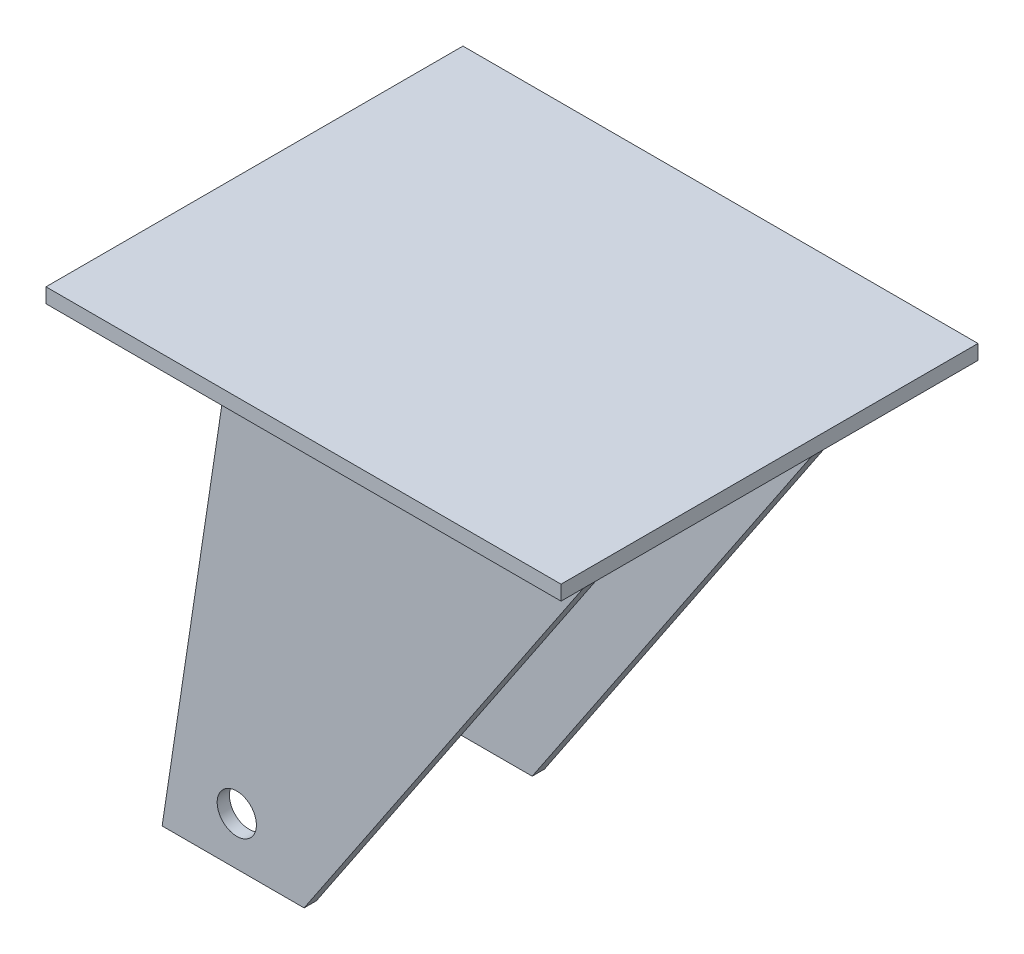
ISO-10303-21;
HEADER;
FILE_DESCRIPTION(('STEP AP214'),'2;1');
FILE_NAME('part.step','',(''),(''),'','','');
FILE_SCHEMA(('AUTOMOTIVE_DESIGN { 1 0 10303 214 1 1 1 1 }'));
ENDSEC;
DATA;
#1=APPLICATION_CONTEXT('core data for automotive mechanical design processes');
#2=APPLICATION_PROTOCOL_DEFINITION('international standard','automotive_design',2000,#1);
#3=PRODUCT_CONTEXT('',#1,'mechanical');
#4=PRODUCT('Part','Part','',(#3));
#5=PRODUCT_RELATED_PRODUCT_CATEGORY('part','',(#4));
#6=PRODUCT_DEFINITION_FORMATION('','',#4);
#7=PRODUCT_DEFINITION_CONTEXT('part definition',#1,'design');
#8=PRODUCT_DEFINITION('design','',#6,#7);
#9=PRODUCT_DEFINITION_SHAPE('','',#8);
#10=(LENGTH_UNIT() NAMED_UNIT(*) SI_UNIT(.MILLI.,.METRE.));
#11=(NAMED_UNIT(*) PLANE_ANGLE_UNIT() SI_UNIT($,.RADIAN.));
#12=(NAMED_UNIT(*) SI_UNIT($,.STERADIAN.) SOLID_ANGLE_UNIT());
#13=UNCERTAINTY_MEASURE_WITH_UNIT(LENGTH_MEASURE(1.E-05),#10,'distance_accuracy_value','');
#14=(GEOMETRIC_REPRESENTATION_CONTEXT(3) GLOBAL_UNCERTAINTY_ASSIGNED_CONTEXT((#13)) GLOBAL_UNIT_ASSIGNED_CONTEXT((#10,
#11,#12)) REPRESENTATION_CONTEXT('',''));
#15=CARTESIAN_POINT('',(0.,0.,0.));
#16=DIRECTION('',(0.,0.,1.));
#17=DIRECTION('',(1.,0.,0.));
#18=AXIS2_PLACEMENT_3D('',#15,#16,#17);
#19=CARTESIAN_POINT('',(-58.5630235636927,3.,-67.981367852476));
#20=DIRECTION('',(1.,0.,0.));
#21=DIRECTION('',(0.,0.,-1.));
#22=AXIS2_PLACEMENT_3D('',#19,#20,#21);
#23=PLANE('',#22);
#24=DIRECTION('',(0.,0.,1.));
#25=VECTOR('',#24,1.);
#26=CARTESIAN_POINT('',(-58.5630235636927,0.,-67.981367852476));
#27=LINE('',#26,#25);
#28=CARTESIAN_POINT('',(-58.5630235636927,0.,-152.981367852476));
#29=VERTEX_POINT('',#28);
#30=CARTESIAN_POINT('',(-58.5630235636927,0.,-67.981367852476));
#31=VERTEX_POINT('',#30);
#32=EDGE_CURVE('E185',#29,#31,#27,.T.);
#33=ORIENTED_EDGE('',*,*,#32,.T.);
#34=DIRECTION('',(0.,-1.,0.));
#35=VECTOR('',#34,1.);
#36=CARTESIAN_POINT('',(-58.5630235636927,3.,-67.981367852476));
#37=LINE('',#36,#35);
#38=CARTESIAN_POINT('',(-58.5630235636927,3.,-67.981367852476));
#39=VERTEX_POINT('',#38);
#40=EDGE_CURVE('E11',#39,#31,#37,.T.);
#41=ORIENTED_EDGE('',*,*,#40,.F.);
#42=DIRECTION('',(0.,0.,1.));
#43=VECTOR('',#42,1.);
#44=CARTESIAN_POINT('',(-58.5630235636927,3.,-67.981367852476));
#45=LINE('',#44,#43);
#46=CARTESIAN_POINT('',(-58.5630235636927,3.,-152.981367852476));
#47=VERTEX_POINT('',#46);
#48=EDGE_CURVE('E192',#47,#39,#45,.T.);
#49=ORIENTED_EDGE('',*,*,#48,.F.);
#50=DIRECTION('',(0.,-1.,0.));
#51=VECTOR('',#50,1.);
#52=CARTESIAN_POINT('',(-58.5630235636927,3.,-152.981367852476));
#53=LINE('',#52,#51);
#54=EDGE_CURVE('E202',#47,#29,#53,.T.);
#55=ORIENTED_EDGE('',*,*,#54,.T.);
#56=EDGE_LOOP('',(#33,#41,#49,#55));
#57=FACE_BOUND('',#56,.T.);
#58=ADVANCED_FACE('F33',(#57),#23,.F.);
#59=CARTESIAN_POINT('',(46.4369764363073,3.,-67.9813678524761));
#60=DIRECTION('',(0.,0.,-1.));
#61=DIRECTION('',(-1.,0.,0.));
#62=AXIS2_PLACEMENT_3D('',#59,#60,#61);
#63=PLANE('',#62);
#64=DIRECTION('',(1.,0.,0.));
#65=VECTOR('',#64,1.);
#66=CARTESIAN_POINT('',(46.4369764363073,0.,-67.9813678524761));
#67=LINE('',#66,#65);
#68=CARTESIAN_POINT('',(46.4369764363073,0.,-67.9813678524761));
#69=VERTEX_POINT('',#68);
#70=EDGE_CURVE('E205',#31,#69,#67,.T.);
#71=ORIENTED_EDGE('',*,*,#70,.T.);
#72=DIRECTION('',(0.,-1.,0.));
#73=VECTOR('',#72,1.);
#74=CARTESIAN_POINT('',(46.4369764363073,3.,-67.9813678524761));
#75=LINE('',#74,#73);
#76=CARTESIAN_POINT('',(46.4369764363073,3.,-67.9813678524761));
#77=VERTEX_POINT('',#76);
#78=EDGE_CURVE('E40',#77,#69,#75,.T.);
#79=ORIENTED_EDGE('',*,*,#78,.F.);
#80=DIRECTION('',(1.,0.,0.));
#81=VECTOR('',#80,1.);
#82=CARTESIAN_POINT('',(46.4369764363073,3.,-67.9813678524761));
#83=LINE('',#82,#81);
#84=EDGE_CURVE('E195',#39,#77,#83,.T.);
#85=ORIENTED_EDGE('',*,*,#84,.F.);
#86=ORIENTED_EDGE('',*,*,#40,.T.);
#87=EDGE_LOOP('',(#71,#79,#85,#86));
#88=FACE_BOUND('',#87,.T.);
#89=ADVANCED_FACE('F235',(#88),#63,.F.);
#90=CARTESIAN_POINT('',(46.4369764363073,3.,-67.9813678524761));
#91=DIRECTION('',(-1.,0.,0.));
#92=DIRECTION('',(0.,0.,1.));
#93=AXIS2_PLACEMENT_3D('',#90,#91,#92);
#94=PLANE('',#93);
#95=DIRECTION('',(0.,0.,-1.));
#96=VECTOR('',#95,1.);
#97=CARTESIAN_POINT('',(46.4369764363073,0.,-67.9813678524761));
#98=LINE('',#97,#96);
#99=CARTESIAN_POINT('',(46.4369764363073,0.,-152.981367852476));
#100=VERTEX_POINT('',#99);
#101=EDGE_CURVE('E207',#69,#100,#98,.T.);
#102=ORIENTED_EDGE('',*,*,#101,.T.);
#103=DIRECTION('',(0.,-1.,0.));
#104=VECTOR('',#103,1.);
#105=CARTESIAN_POINT('',(46.4369764363073,3.,-152.981367852476));
#106=LINE('',#105,#104);
#107=CARTESIAN_POINT('',(46.4369764363073,3.,-152.981367852476));
#108=VERTEX_POINT('',#107);
#109=EDGE_CURVE('E212',#108,#100,#106,.T.);
#110=ORIENTED_EDGE('',*,*,#109,.F.);
#111=DIRECTION('',(0.,0.,-1.));
#112=VECTOR('',#111,1.);
#113=CARTESIAN_POINT('',(46.4369764363073,3.,-67.9813678524761));
#114=LINE('',#113,#112);
#115=EDGE_CURVE('E198',#77,#108,#114,.T.);
#116=ORIENTED_EDGE('',*,*,#115,.F.);
#117=ORIENTED_EDGE('',*,*,#78,.T.);
#118=EDGE_LOOP('',(#102,#110,#116,#117));
#119=FACE_BOUND('',#118,.T.);
#120=ADVANCED_FACE('F219',(#119),#94,.F.);
#121=CARTESIAN_POINT('',(46.4369764363073,3.,-152.981367852476));
#122=DIRECTION('',(0.,0.,1.));
#123=DIRECTION('',(1.,0.,0.));
#124=AXIS2_PLACEMENT_3D('',#121,#122,#123);
#125=PLANE('',#124);
#126=DIRECTION('',(-1.,0.,0.));
#127=VECTOR('',#126,1.);
#128=CARTESIAN_POINT('',(46.4369764363073,0.,-152.981367852476));
#129=LINE('',#128,#127);
#130=EDGE_CURVE('E196',#100,#29,#129,.T.);
#131=ORIENTED_EDGE('',*,*,#130,.T.);
#132=ORIENTED_EDGE('',*,*,#54,.F.);
#133=DIRECTION('',(-1.,0.,0.));
#134=VECTOR('',#133,1.);
#135=CARTESIAN_POINT('',(46.4369764363073,3.,-152.981367852476));
#136=LINE('',#135,#134);
#137=EDGE_CURVE('E200',#108,#47,#136,.T.);
#138=ORIENTED_EDGE('',*,*,#137,.F.);
#139=ORIENTED_EDGE('',*,*,#109,.T.);
#140=EDGE_LOOP('',(#131,#132,#138,#139));
#141=FACE_BOUND('',#140,.T.);
#142=ADVANCED_FACE('F228',(#141),#125,.F.);
#143=CARTESIAN_POINT('',(0.,3.,0.));
#144=DIRECTION('',(0.,1.,0.));
#145=DIRECTION('',(0.,0.,1.));
#146=AXIS2_PLACEMENT_3D('',#143,#144,#145);
#147=PLANE('',#146);
#148=ORIENTED_EDGE('',*,*,#48,.T.);
#149=ORIENTED_EDGE('',*,*,#84,.T.);
#150=ORIENTED_EDGE('',*,*,#115,.T.);
#151=ORIENTED_EDGE('',*,*,#137,.T.);
#152=EDGE_LOOP('',(#148,#149,#150,#151));
#153=FACE_BOUND('',#152,.T.);
#154=ADVANCED_FACE('F234',(#153),#147,.T.);
#155=CARTESIAN_POINT('',(0.,0.,0.));
#156=DIRECTION('',(0.,1.,0.));
#157=DIRECTION('',(0.,0.,1.));
#158=AXIS2_PLACEMENT_3D('',#155,#156,#157);
#159=PLANE('',#158);
#160=DIRECTION('',(0.,0.,-1.));
#161=VECTOR('',#160,1.);
#162=CARTESIAN_POINT('',(-38.,0.,-132.481367852476));
#163=LINE('',#162,#161);
#164=CARTESIAN_POINT('',(-38.,0.,-132.481367852476));
#165=VERTEX_POINT('',#164);
#166=CARTESIAN_POINT('',(-38.,0.,-134.981367852476));
#167=VERTEX_POINT('',#166);
#168=EDGE_CURVE('E47',#165,#167,#163,.T.);
#169=ORIENTED_EDGE('',*,*,#168,.F.);
#170=DIRECTION('',(1.,0.,0.));
#171=VECTOR('',#170,1.);
#172=CARTESIAN_POINT('',(42.,0.,-132.481367852476));
#173=LINE('',#172,#171);
#174=CARTESIAN_POINT('',(42.,0.,-132.481367852476));
#175=VERTEX_POINT('',#174);
#176=EDGE_CURVE('E51',#165,#175,#173,.T.);
#177=ORIENTED_EDGE('',*,*,#176,.T.);
#178=DIRECTION('',(0.,0.,-1.));
#179=VECTOR('',#178,1.);
#180=CARTESIAN_POINT('',(42.,0.,-132.481367852476));
#181=LINE('',#180,#179);
#182=CARTESIAN_POINT('',(42.,0.,-134.981367852476));
#183=VERTEX_POINT('',#182);
#184=EDGE_CURVE('E131',#175,#183,#181,.T.);
#185=ORIENTED_EDGE('',*,*,#184,.T.);
#186=DIRECTION('',(1.,0.,0.));
#187=VECTOR('',#186,1.);
#188=CARTESIAN_POINT('',(42.,0.,-134.981367852476));
#189=LINE('',#188,#187);
#190=EDGE_CURVE('E147',#167,#183,#189,.T.);
#191=ORIENTED_EDGE('',*,*,#190,.F.);
#192=EDGE_LOOP('',(#169,#177,#185,#191));
#193=FACE_BOUND('',#192,.T.);
#194=DIRECTION('',(0.,0.,1.));
#195=VECTOR('',#194,1.);
#196=CARTESIAN_POINT('',(42.,0.,-88.4813678524761));
#197=LINE('',#196,#195);
#198=CARTESIAN_POINT('',(42.,0.,-88.4813678524761));
#199=VERTEX_POINT('',#198);
#200=CARTESIAN_POINT('',(42.,0.,-85.9813678524761));
#201=VERTEX_POINT('',#200);
#202=EDGE_CURVE('E186',#199,#201,#197,.T.);
#203=ORIENTED_EDGE('',*,*,#202,.F.);
#204=DIRECTION('',(-1.,0.,0.));
#205=VECTOR('',#204,1.);
#206=CARTESIAN_POINT('',(-38.,0.,-88.4813678524761));
#207=LINE('',#206,#205);
#208=CARTESIAN_POINT('',(-38.,0.,-88.4813678524761));
#209=VERTEX_POINT('',#208);
#210=EDGE_CURVE('E170',#199,#209,#207,.T.);
#211=ORIENTED_EDGE('',*,*,#210,.T.);
#212=DIRECTION('',(0.,0.,1.));
#213=VECTOR('',#212,1.);
#214=CARTESIAN_POINT('',(-38.,0.,-88.4813678524761));
#215=LINE('',#214,#213);
#216=CARTESIAN_POINT('',(-38.,0.,-85.9813678524761));
#217=VERTEX_POINT('',#216);
#218=EDGE_CURVE('E183',#209,#217,#215,.T.);
#219=ORIENTED_EDGE('',*,*,#218,.T.);
#220=DIRECTION('',(-1.,0.,0.));
#221=VECTOR('',#220,1.);
#222=CARTESIAN_POINT('',(-38.,0.,-85.9813678524761));
#223=LINE('',#222,#221);
#224=EDGE_CURVE('E164',#201,#217,#223,.T.);
#225=ORIENTED_EDGE('',*,*,#224,.F.);
#226=EDGE_LOOP('',(#203,#211,#219,#225));
#227=FACE_BOUND('',#226,.T.);
#228=ORIENTED_EDGE('',*,*,#32,.F.);
#229=ORIENTED_EDGE('',*,*,#130,.F.);
#230=ORIENTED_EDGE('',*,*,#101,.F.);
#231=ORIENTED_EDGE('',*,*,#70,.F.);
#232=EDGE_LOOP('',(#228,#229,#230,#231));
#233=FACE_BOUND('',#232,.T.);
#234=ADVANCED_FACE('F225',(#193,#227,#233),#159,.F.);
#235=CARTESIAN_POINT('',(-52.8846058719386,-98.352332447703,-88.4813678524761));
#236=DIRECTION('',(-0.988741193921502,0.149635729164807,0.));
#237=DIRECTION('',(-0.149635729164807,-0.988741193921502,0.));
#238=AXIS2_PLACEMENT_3D('',#235,#236,#237);
#239=PLANE('',#238);
#240=DIRECTION('',(-0.149635729164807,-0.988741193921502,0.));
#241=VECTOR('',#240,1.);
#242=CARTESIAN_POINT('',(-52.8846058719386,-98.352332447703,-85.9813678524761));
#243=LINE('',#242,#241);
#244=CARTESIAN_POINT('',(-52.8846058719386,-98.352332447703,-85.9813678524761));
#245=VERTEX_POINT('',#244);
#246=EDGE_CURVE('E157',#217,#245,#243,.T.);
#247=ORIENTED_EDGE('',*,*,#246,.F.);
#248=ORIENTED_EDGE('',*,*,#218,.F.);
#249=DIRECTION('',(-0.149635729164807,-0.988741193921502,0.));
#250=VECTOR('',#249,1.);
#251=CARTESIAN_POINT('',(-52.8846058719386,-98.352332447703,-88.4813678524761));
#252=LINE('',#251,#250);
#253=CARTESIAN_POINT('',(-52.8846058719386,-98.352332447703,-88.4813678524761));
#254=VERTEX_POINT('',#253);
#255=EDGE_CURVE('E160',#209,#254,#252,.T.);
#256=ORIENTED_EDGE('',*,*,#255,.T.);
#257=DIRECTION('',(0.,0.,1.));
#258=VECTOR('',#257,1.);
#259=CARTESIAN_POINT('',(-52.8846058719386,-98.352332447703,-88.4813678524761));
#260=LINE('',#259,#258);
#261=EDGE_CURVE('E172',#254,#245,#260,.T.);
#262=ORIENTED_EDGE('',*,*,#261,.T.);
#263=EDGE_LOOP('',(#247,#248,#256,#262));
#264=FACE_BOUND('',#263,.T.);
#265=ADVANCED_FACE('F247',(#264),#239,.T.);
#266=CARTESIAN_POINT('',(42.,0.,-88.4813678524761));
#267=DIRECTION('',(0.830574476071231,-0.556907568362111,0.));
#268=DIRECTION('',(0.556907568362111,0.830574476071231,0.));
#269=AXIS2_PLACEMENT_3D('',#266,#267,#268);
#270=PLANE('',#269);
#271=DIRECTION('',(0.556907568362111,0.830574476071231,0.));
#272=VECTOR('',#271,1.);
#273=CARTESIAN_POINT('',(42.,0.,-85.9813678524761));
#274=LINE('',#273,#272);
#275=CARTESIAN_POINT('',(-23.946113062948,-98.352332447703,-85.9813678524761));
#276=VERTEX_POINT('',#275);
#277=EDGE_CURVE('E178',#276,#201,#274,.T.);
#278=ORIENTED_EDGE('',*,*,#277,.F.);
#279=DIRECTION('',(0.,0.,1.));
#280=VECTOR('',#279,1.);
#281=CARTESIAN_POINT('',(-23.946113062948,-98.352332447703,-88.4813678524761));
#282=LINE('',#281,#280);
#283=CARTESIAN_POINT('',(-23.946113062948,-98.352332447703,-88.4813678524761));
#284=VERTEX_POINT('',#283);
#285=EDGE_CURVE('E189',#284,#276,#282,.T.);
#286=ORIENTED_EDGE('',*,*,#285,.F.);
#287=DIRECTION('',(0.556907568362111,0.830574476071231,0.));
#288=VECTOR('',#287,1.);
#289=CARTESIAN_POINT('',(42.,0.,-88.4813678524761));
#290=LINE('',#289,#288);
#291=EDGE_CURVE('E167',#284,#199,#290,.T.);
#292=ORIENTED_EDGE('',*,*,#291,.T.);
#293=ORIENTED_EDGE('',*,*,#202,.T.);
#294=EDGE_LOOP('',(#278,#286,#292,#293));
#295=FACE_BOUND('',#294,.T.);
#296=ADVANCED_FACE('F252',(#295),#270,.T.);
#297=CARTESIAN_POINT('',(-23.946113062948,-98.352332447703,-88.4813678524761));
#298=DIRECTION('',(0.,-1.,0.));
#299=DIRECTION('',(0.,0.,-1.));
#300=AXIS2_PLACEMENT_3D('',#297,#298,#299);
#301=PLANE('',#300);
#302=DIRECTION('',(1.,0.,0.));
#303=VECTOR('',#302,1.);
#304=CARTESIAN_POINT('',(-23.946113062948,-98.352332447703,-85.9813678524761));
#305=LINE('',#304,#303);
#306=EDGE_CURVE('E175',#245,#276,#305,.T.);
#307=ORIENTED_EDGE('',*,*,#306,.F.);
#308=ORIENTED_EDGE('',*,*,#261,.F.);
#309=DIRECTION('',(1.,0.,0.));
#310=VECTOR('',#309,1.);
#311=CARTESIAN_POINT('',(-23.946113062948,-98.352332447703,-88.4813678524761));
#312=LINE('',#311,#310);
#313=EDGE_CURVE('E163',#254,#284,#312,.T.);
#314=ORIENTED_EDGE('',*,*,#313,.T.);
#315=ORIENTED_EDGE('',*,*,#285,.T.);
#316=EDGE_LOOP('',(#307,#308,#314,#315));
#317=FACE_BOUND('',#316,.T.);
#318=ADVANCED_FACE('F254',(#317),#301,.T.);
#319=CARTESIAN_POINT('',(0.,0.,-88.4813678524761));
#320=DIRECTION('',(0.,0.,-1.));
#321=DIRECTION('',(-1.,0.,0.));
#322=AXIS2_PLACEMENT_3D('',#319,#320,#321);
#323=PLANE('',#322);
#324=CARTESIAN_POINT('',(-37.6699939818226,-88.5743198813134,-88.4813678524761));
#325=DIRECTION('',(0.,0.,-1.));
#326=DIRECTION('',(-1.,0.,0.));
#327=AXIS2_PLACEMENT_3D('',#324,#325,#326);
#328=CIRCLE('',#327,4.00000000000001);
#329=CARTESIAN_POINT('',(-41.6699939818226,-88.5743198813134,-88.4813678524761));
#330=VERTEX_POINT('',#329);
#331=EDGE_CURVE('E151',#330,#330,#328,.T.);
#332=ORIENTED_EDGE('',*,*,#331,.F.);
#333=EDGE_LOOP('',(#332));
#334=FACE_BOUND('',#333,.T.);
#335=ORIENTED_EDGE('',*,*,#255,.F.);
#336=ORIENTED_EDGE('',*,*,#210,.F.);
#337=ORIENTED_EDGE('',*,*,#291,.F.);
#338=ORIENTED_EDGE('',*,*,#313,.F.);
#339=EDGE_LOOP('',(#335,#336,#337,#338));
#340=FACE_BOUND('',#339,.T.);
#341=ADVANCED_FACE('F257',(#334,#340),#323,.T.);
#342=CARTESIAN_POINT('',(0.,0.,-85.9813678524761));
#343=DIRECTION('',(0.,0.,-1.));
#344=DIRECTION('',(-1.,0.,0.));
#345=AXIS2_PLACEMENT_3D('',#342,#343,#344);
#346=PLANE('',#345);
#347=CARTESIAN_POINT('',(-37.6699939818226,-88.5743198813134,-85.9813678524761));
#348=DIRECTION('',(0.,0.,-1.));
#349=DIRECTION('',(-1.,0.,0.));
#350=AXIS2_PLACEMENT_3D('',#347,#348,#349);
#351=CIRCLE('',#350,4.00000000000001);
#352=CARTESIAN_POINT('',(-41.6699939818226,-88.5743198813134,-85.9813678524761));
#353=VERTEX_POINT('',#352);
#354=EDGE_CURVE('E300',#353,#353,#351,.T.);
#355=ORIENTED_EDGE('',*,*,#354,.T.);
#356=EDGE_LOOP('',(#355));
#357=FACE_BOUND('',#356,.T.);
#358=ORIENTED_EDGE('',*,*,#246,.T.);
#359=ORIENTED_EDGE('',*,*,#306,.T.);
#360=ORIENTED_EDGE('',*,*,#277,.T.);
#361=ORIENTED_EDGE('',*,*,#224,.T.);
#362=EDGE_LOOP('',(#358,#359,#360,#361));
#363=FACE_BOUND('',#362,.T.);
#364=ADVANCED_FACE('F262',(#357,#363),#346,.F.);
#365=CARTESIAN_POINT('',(-38.,0.,-132.481367852476));
#366=DIRECTION('',(-0.988741193921502,0.149635729164807,0.));
#367=DIRECTION('',(-0.149635729164807,-0.988741193921502,0.));
#368=AXIS2_PLACEMENT_3D('',#365,#366,#367);
#369=PLANE('',#368);
#370=DIRECTION('',(0.149635729164807,0.988741193921502,0.));
#371=VECTOR('',#370,1.);
#372=CARTESIAN_POINT('',(-38.,0.,-134.981367852476));
#373=LINE('',#372,#371);
#374=CARTESIAN_POINT('',(-52.8846058719386,-98.352332447703,-134.981367852476));
#375=VERTEX_POINT('',#374);
#376=EDGE_CURVE('E142',#375,#167,#373,.T.);
#377=ORIENTED_EDGE('',*,*,#376,.F.);
#378=DIRECTION('',(0.,0.,-1.));
#379=VECTOR('',#378,1.);
#380=CARTESIAN_POINT('',(-52.8846058719386,-98.352332447703,-132.481367852476));
#381=LINE('',#380,#379);
#382=CARTESIAN_POINT('',(-52.8846058719386,-98.352332447703,-132.481367852476));
#383=VERTEX_POINT('',#382);
#384=EDGE_CURVE('E130',#383,#375,#381,.T.);
#385=ORIENTED_EDGE('',*,*,#384,.F.);
#386=DIRECTION('',(0.149635729164807,0.988741193921502,0.));
#387=VECTOR('',#386,1.);
#388=CARTESIAN_POINT('',(-38.,0.,-132.481367852476));
#389=LINE('',#388,#387);
#390=EDGE_CURVE('E138',#383,#165,#389,.T.);
#391=ORIENTED_EDGE('',*,*,#390,.T.);
#392=ORIENTED_EDGE('',*,*,#168,.T.);
#393=EDGE_LOOP('',(#377,#385,#391,#392));
#394=FACE_BOUND('',#393,.T.);
#395=ADVANCED_FACE('F265',(#394),#369,.T.);
#396=CARTESIAN_POINT('',(-52.8846058719386,-98.352332447703,-132.481367852476));
#397=DIRECTION('',(0.,-1.,0.));
#398=DIRECTION('',(0.,0.,-1.));
#399=AXIS2_PLACEMENT_3D('',#396,#397,#398);
#400=PLANE('',#399);
#401=DIRECTION('',(-1.,0.,0.));
#402=VECTOR('',#401,1.);
#403=CARTESIAN_POINT('',(-52.8846058719386,-98.352332447703,-134.981367852476));
#404=LINE('',#403,#402);
#405=CARTESIAN_POINT('',(-23.946113062948,-98.352332447703,-134.981367852476));
#406=VERTEX_POINT('',#405);
#407=EDGE_CURVE('E125',#406,#375,#404,.T.);
#408=ORIENTED_EDGE('',*,*,#407,.F.);
#409=DIRECTION('',(0.,0.,-1.));
#410=VECTOR('',#409,1.);
#411=CARTESIAN_POINT('',(-23.946113062948,-98.352332447703,-132.481367852476));
#412=LINE('',#411,#410);
#413=CARTESIAN_POINT('',(-23.946113062948,-98.352332447703,-132.481367852476));
#414=VERTEX_POINT('',#413);
#415=EDGE_CURVE('E119',#414,#406,#412,.T.);
#416=ORIENTED_EDGE('',*,*,#415,.F.);
#417=DIRECTION('',(-1.,0.,0.));
#418=VECTOR('',#417,1.);
#419=CARTESIAN_POINT('',(-52.8846058719386,-98.352332447703,-132.481367852476));
#420=LINE('',#419,#418);
#421=EDGE_CURVE('E122',#414,#383,#420,.T.);
#422=ORIENTED_EDGE('',*,*,#421,.T.);
#423=ORIENTED_EDGE('',*,*,#384,.T.);
#424=EDGE_LOOP('',(#408,#416,#422,#423));
#425=FACE_BOUND('',#424,.T.);
#426=ADVANCED_FACE('F121',(#425),#400,.T.);
#427=CARTESIAN_POINT('',(-23.946113062948,-98.352332447703,-132.481367852476));
#428=DIRECTION('',(0.830574476071231,-0.556907568362111,0.));
#429=DIRECTION('',(0.556907568362111,0.830574476071231,0.));
#430=AXIS2_PLACEMENT_3D('',#427,#428,#429);
#431=PLANE('',#430);
#432=DIRECTION('',(-0.556907568362111,-0.830574476071231,0.));
#433=VECTOR('',#432,1.);
#434=CARTESIAN_POINT('',(-23.946113062948,-98.352332447703,-134.981367852476));
#435=LINE('',#434,#433);
#436=EDGE_CURVE('E150',#183,#406,#435,.T.);
#437=ORIENTED_EDGE('',*,*,#436,.F.);
#438=ORIENTED_EDGE('',*,*,#184,.F.);
#439=DIRECTION('',(-0.556907568362111,-0.830574476071231,0.));
#440=VECTOR('',#439,1.);
#441=CARTESIAN_POINT('',(-23.946113062948,-98.352332447703,-132.481367852476));
#442=LINE('',#441,#440);
#443=EDGE_CURVE('E136',#175,#414,#442,.T.);
#444=ORIENTED_EDGE('',*,*,#443,.T.);
#445=ORIENTED_EDGE('',*,*,#415,.T.);
#446=EDGE_LOOP('',(#437,#438,#444,#445));
#447=FACE_BOUND('',#446,.T.);
#448=ADVANCED_FACE('F140',(#447),#431,.T.);
#449=CARTESIAN_POINT('',(0.,0.,-132.481367852476));
#450=DIRECTION('',(0.,0.,1.));
#451=DIRECTION('',(1.,0.,0.));
#452=AXIS2_PLACEMENT_3D('',#449,#450,#451);
#453=PLANE('',#452);
#454=CARTESIAN_POINT('',(-37.6699939818226,-88.5743198813134,-132.481367852476));
#455=DIRECTION('',(0.,0.,1.));
#456=DIRECTION('',(1.,0.,0.));
#457=AXIS2_PLACEMENT_3D('',#454,#455,#456);
#458=CIRCLE('',#457,4.00000000000001);
#459=CARTESIAN_POINT('',(-33.6699939818226,-88.5743198813134,-132.481367852476));
#460=VERTEX_POINT('',#459);
#461=EDGE_CURVE('E295',#460,#460,#458,.T.);
#462=ORIENTED_EDGE('',*,*,#461,.F.);
#463=EDGE_LOOP('',(#462));
#464=FACE_BOUND('',#463,.T.);
#465=ORIENTED_EDGE('',*,*,#176,.F.);
#466=ORIENTED_EDGE('',*,*,#390,.F.);
#467=ORIENTED_EDGE('',*,*,#421,.F.);
#468=ORIENTED_EDGE('',*,*,#443,.F.);
#469=EDGE_LOOP('',(#465,#466,#467,#468));
#470=FACE_BOUND('',#469,.T.);
#471=ADVANCED_FACE('F135',(#464,#470),#453,.T.);
#472=CARTESIAN_POINT('',(0.,0.,-134.981367852476));
#473=DIRECTION('',(0.,0.,1.));
#474=DIRECTION('',(1.,0.,0.));
#475=AXIS2_PLACEMENT_3D('',#472,#473,#474);
#476=PLANE('',#475);
#477=CARTESIAN_POINT('',(-37.6699939818226,-88.5743198813134,-134.981367852476));
#478=DIRECTION('',(0.,0.,-1.));
#479=DIRECTION('',(-1.,0.,0.));
#480=AXIS2_PLACEMENT_3D('',#477,#478,#479);
#481=CIRCLE('',#480,4.00000000000001);
#482=CARTESIAN_POINT('',(-41.6699939818226,-88.5743198813134,-134.981367852476));
#483=VERTEX_POINT('',#482);
#484=EDGE_CURVE('E298',#483,#483,#481,.T.);
#485=ORIENTED_EDGE('',*,*,#484,.F.);
#486=EDGE_LOOP('',(#485));
#487=FACE_BOUND('',#486,.T.);
#488=ORIENTED_EDGE('',*,*,#190,.T.);
#489=ORIENTED_EDGE('',*,*,#436,.T.);
#490=ORIENTED_EDGE('',*,*,#407,.T.);
#491=ORIENTED_EDGE('',*,*,#376,.T.);
#492=EDGE_LOOP('',(#488,#489,#490,#491));
#493=FACE_BOUND('',#492,.T.);
#494=ADVANCED_FACE('F277',(#487,#493),#476,.F.);
#495=CARTESIAN_POINT('',(-37.6699939818226,-88.5743198813134,-67.981367852476));
#496=DIRECTION('',(0.,0.,-1.));
#497=DIRECTION('',(-1.,0.,0.));
#498=AXIS2_PLACEMENT_3D('',#495,#496,#497);
#499=CYLINDRICAL_SURFACE('',#498,4.00000000000001);
#500=ORIENTED_EDGE('',*,*,#461,.T.);
#501=EDGE_LOOP('',(#500));
#502=FACE_BOUND('',#501,.T.);
#503=ORIENTED_EDGE('',*,*,#484,.T.);
#504=EDGE_LOOP('',(#503));
#505=FACE_BOUND('',#504,.T.);
#506=ADVANCED_FACE('F280',(#502,#505),#499,.F.);
#507=ORIENTED_EDGE('',*,*,#331,.T.);
#508=EDGE_LOOP('',(#507));
#509=FACE_BOUND('',#508,.T.);
#510=ORIENTED_EDGE('',*,*,#354,.F.);
#511=EDGE_LOOP('',(#510));
#512=FACE_BOUND('',#511,.T.);
#513=ADVANCED_FACE('F286',(#509,#512),#499,.F.);
#514=CLOSED_SHELL('',(#58,#89,#120,#142,#154,#234,#265,#296,#318,#341,#364,#395,#426,#448,#471,
#494,#506,#513));
#515=MANIFOLD_SOLID_BREP('B2',#514);
#516=ADVANCED_BREP_SHAPE_REPRESENTATION('',(#18,#515),#14);
#517=SHAPE_DEFINITION_REPRESENTATION(#9,#516);
ENDSEC;
END-ISO-10303-21;
